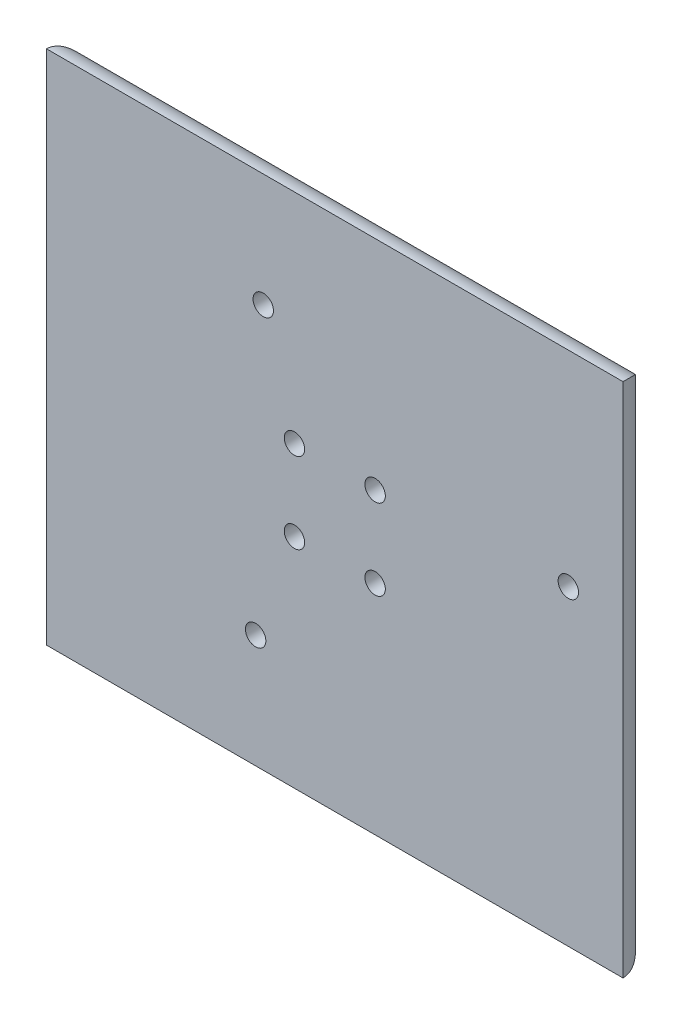
ISO-10303-21;
HEADER;
FILE_DESCRIPTION(('STEP AP214'),'2;1');
FILE_NAME('part.step','',(''),(''),'','','');
FILE_SCHEMA(('AUTOMOTIVE_DESIGN { 1 0 10303 214 1 1 1 1 }'));
ENDSEC;
DATA;
#1=APPLICATION_CONTEXT('core data for automotive mechanical design processes');
#2=APPLICATION_PROTOCOL_DEFINITION('international standard','automotive_design',2000,#1);
#3=PRODUCT_CONTEXT('',#1,'mechanical');
#4=PRODUCT('Part','Part','',(#3));
#5=PRODUCT_RELATED_PRODUCT_CATEGORY('part','',(#4));
#6=PRODUCT_DEFINITION_FORMATION('','',#4);
#7=PRODUCT_DEFINITION_CONTEXT('part definition',#1,'design');
#8=PRODUCT_DEFINITION('design','',#6,#7);
#9=PRODUCT_DEFINITION_SHAPE('','',#8);
#10=(LENGTH_UNIT() NAMED_UNIT(*) SI_UNIT(.MILLI.,.METRE.));
#11=(NAMED_UNIT(*) PLANE_ANGLE_UNIT() SI_UNIT($,.RADIAN.));
#12=(NAMED_UNIT(*) SI_UNIT($,.STERADIAN.) SOLID_ANGLE_UNIT());
#13=UNCERTAINTY_MEASURE_WITH_UNIT(LENGTH_MEASURE(1.E-05),#10,'distance_accuracy_value','');
#14=(GEOMETRIC_REPRESENTATION_CONTEXT(3) GLOBAL_UNCERTAINTY_ASSIGNED_CONTEXT((#13)) GLOBAL_UNIT_ASSIGNED_CONTEXT((#10,
#11,#12)) REPRESENTATION_CONTEXT('',''));
#15=CARTESIAN_POINT('',(0.,0.,0.));
#16=DIRECTION('',(0.,0.,1.));
#17=DIRECTION('',(1.,0.,0.));
#18=AXIS2_PLACEMENT_3D('',#15,#16,#17);
#19=CARTESIAN_POINT('',(0.,0.,5.));
#20=DIRECTION('',(0.,0.,1.));
#21=DIRECTION('',(1.,0.,0.));
#22=AXIS2_PLACEMENT_3D('',#19,#20,#21);
#23=PLANE('',#22);
#24=CARTESIAN_POINT('',(-9.71,10.9605362269612,5.));
#25=DIRECTION('',(0.,0.,1.));
#26=DIRECTION('',(1.,0.,0.));
#27=AXIS2_PLACEMENT_3D('',#24,#25,#26);
#28=CIRCLE('',#27,1.7);
#29=CARTESIAN_POINT('',(-8.01,10.9605362269612,5.));
#30=VERTEX_POINT('',#29);
#31=EDGE_CURVE('E164',#30,#30,#28,.T.);
#32=ORIENTED_EDGE('',*,*,#31,.F.);
#33=EDGE_LOOP('',(#32));
#34=FACE_BOUND('',#33,.T.);
#35=CARTESIAN_POINT('',(41.09,-4.27946377303883,5.));
#36=DIRECTION('',(0.,0.,1.));
#37=DIRECTION('',(1.,0.,0.));
#38=AXIS2_PLACEMENT_3D('',#35,#36,#37);
#39=CIRCLE('',#38,1.7);
#40=CARTESIAN_POINT('',(42.79,-4.27946377303883,5.));
#41=VERTEX_POINT('',#40);
#42=EDGE_CURVE('E166',#41,#41,#39,.T.);
#43=ORIENTED_EDGE('',*,*,#42,.F.);
#44=EDGE_LOOP('',(#43));
#45=FACE_BOUND('',#44,.T.);
#46=CARTESIAN_POINT('',(-10.98,-37.2994637730388,5.));
#47=DIRECTION('',(0.,0.,1.));
#48=DIRECTION('',(1.,0.,0.));
#49=AXIS2_PLACEMENT_3D('',#46,#47,#48);
#50=CIRCLE('',#49,1.7);
#51=CARTESIAN_POINT('',(-9.28,-37.2994637730388,5.));
#52=VERTEX_POINT('',#51);
#53=EDGE_CURVE('E174',#52,#52,#50,.T.);
#54=ORIENTED_EDGE('',*,*,#53,.F.);
#55=EDGE_LOOP('',(#54));
#56=FACE_BOUND('',#55,.T.);
#57=CARTESIAN_POINT('',(-4.5175144212722,-19.876978194311,5.));
#58=DIRECTION('',(0.,0.,1.));
#59=DIRECTION('',(1.,0.,0.));
#60=AXIS2_PLACEMENT_3D('',#57,#58,#59);
#61=CIRCLE('',#60,1.7);
#62=CARTESIAN_POINT('',(-2.8175144212722,-19.876978194311,5.));
#63=VERTEX_POINT('',#62);
#64=EDGE_CURVE('E180',#63,#63,#61,.T.);
#65=ORIENTED_EDGE('',*,*,#64,.F.);
#66=EDGE_LOOP('',(#65));
#67=FACE_BOUND('',#66,.T.);
#68=CARTESIAN_POINT('',(-4.5175144212722,-6.44194935176663,5.));
#69=DIRECTION('',(0.,0.,1.));
#70=DIRECTION('',(1.,0.,0.));
#71=AXIS2_PLACEMENT_3D('',#68,#69,#70);
#72=CIRCLE('',#71,1.7);
#73=CARTESIAN_POINT('',(-2.8175144212722,-6.44194935176663,5.));
#74=VERTEX_POINT('',#73);
#75=EDGE_CURVE('E186',#74,#74,#72,.T.);
#76=ORIENTED_EDGE('',*,*,#75,.F.);
#77=EDGE_LOOP('',(#76));
#78=FACE_BOUND('',#77,.T.);
#79=CARTESIAN_POINT('',(8.9175144212722,-6.44194935176663,5.));
#80=DIRECTION('',(0.,0.,1.));
#81=DIRECTION('',(1.,0.,0.));
#82=AXIS2_PLACEMENT_3D('',#79,#80,#81);
#83=CIRCLE('',#82,1.7);
#84=CARTESIAN_POINT('',(10.6175144212722,-6.44194935176663,5.));
#85=VERTEX_POINT('',#84);
#86=EDGE_CURVE('E192',#85,#85,#83,.T.);
#87=ORIENTED_EDGE('',*,*,#86,.F.);
#88=EDGE_LOOP('',(#87));
#89=FACE_BOUND('',#88,.T.);
#90=CARTESIAN_POINT('',(8.9175144212722,-19.876978194311,5.));
#91=DIRECTION('',(0.,0.,1.));
#92=DIRECTION('',(1.,0.,0.));
#93=AXIS2_PLACEMENT_3D('',#90,#91,#92);
#94=CIRCLE('',#93,1.7);
#95=CARTESIAN_POINT('',(10.6175144212722,-19.876978194311,5.));
#96=VERTEX_POINT('',#95);
#97=EDGE_CURVE('E198',#96,#96,#94,.T.);
#98=ORIENTED_EDGE('',*,*,#97,.F.);
#99=EDGE_LOOP('',(#98));
#100=FACE_BOUND('',#99,.T.);
#101=DIRECTION('',(0.,-1.,0.));
#102=VECTOR('',#101,1.);
#103=CARTESIAN_POINT('',(-45.8,-56.1594637730388,5.));
#104=LINE('',#103,#102);
#105=CARTESIAN_POINT('',(-45.8,29.8405362269612,5.));
#106=VERTEX_POINT('',#105);
#107=CARTESIAN_POINT('',(-45.8,-56.1594637730388,5.));
#108=VERTEX_POINT('',#107);
#109=EDGE_CURVE('E76',#106,#108,#104,.T.);
#110=ORIENTED_EDGE('',*,*,#109,.T.);
#111=DIRECTION('',(1.,0.,0.));
#112=VECTOR('',#111,1.);
#113=CARTESIAN_POINT('',(50.2,-56.1594637730388,5.));
#114=LINE('',#113,#112);
#115=CARTESIAN_POINT('',(50.2,-56.1594637730388,5.));
#116=VERTEX_POINT('',#115);
#117=EDGE_CURVE('E79',#108,#116,#114,.T.);
#118=ORIENTED_EDGE('',*,*,#117,.T.);
#119=DIRECTION('',(0.,1.,0.));
#120=VECTOR('',#119,1.);
#121=CARTESIAN_POINT('',(50.2,-56.1594637730388,5.));
#122=LINE('',#121,#120);
#123=CARTESIAN_POINT('',(50.2,29.8405362269612,5.));
#124=VERTEX_POINT('',#123);
#125=EDGE_CURVE('E97',#116,#124,#122,.T.);
#126=ORIENTED_EDGE('',*,*,#125,.T.);
#127=DIRECTION('',(-1.,0.,0.));
#128=VECTOR('',#127,1.);
#129=CARTESIAN_POINT('',(50.2,29.8405362269612,5.));
#130=LINE('',#129,#128);
#131=EDGE_CURVE('E81',#124,#106,#130,.T.);
#132=ORIENTED_EDGE('',*,*,#131,.T.);
#133=EDGE_LOOP('',(#110,#118,#126,#132));
#134=FACE_BOUND('',#133,.T.);
#135=ADVANCED_FACE('F35',(#34,#45,#56,#67,#78,#89,#100,#134),#23,.T.);
#136=CARTESIAN_POINT('',(0.,0.,0.));
#137=DIRECTION('',(0.,0.,1.));
#138=DIRECTION('',(1.,0.,0.));
#139=AXIS2_PLACEMENT_3D('',#136,#137,#138);
#140=PLANE('',#139);
#141=CARTESIAN_POINT('',(-9.71,10.9605362269612,0.));
#142=DIRECTION('',(0.,0.,1.));
#143=DIRECTION('',(1.,0.,0.));
#144=AXIS2_PLACEMENT_3D('',#141,#142,#143);
#145=CIRCLE('',#144,1.7);
#146=CARTESIAN_POINT('',(-8.01,10.9605362269612,0.));
#147=VERTEX_POINT('',#146);
#148=EDGE_CURVE('E162',#147,#147,#145,.T.);
#149=ORIENTED_EDGE('',*,*,#148,.T.);
#150=EDGE_LOOP('',(#149));
#151=FACE_BOUND('',#150,.T.);
#152=CARTESIAN_POINT('',(41.09,-4.27946377303883,0.));
#153=DIRECTION('',(0.,0.,1.));
#154=DIRECTION('',(1.,0.,0.));
#155=AXIS2_PLACEMENT_3D('',#152,#153,#154);
#156=CIRCLE('',#155,1.7);
#157=CARTESIAN_POINT('',(42.79,-4.27946377303883,0.));
#158=VERTEX_POINT('',#157);
#159=EDGE_CURVE('E171',#158,#158,#156,.T.);
#160=ORIENTED_EDGE('',*,*,#159,.T.);
#161=EDGE_LOOP('',(#160));
#162=FACE_BOUND('',#161,.T.);
#163=CARTESIAN_POINT('',(-10.98,-37.2994637730388,0.));
#164=DIRECTION('',(0.,0.,1.));
#165=DIRECTION('',(1.,0.,0.));
#166=AXIS2_PLACEMENT_3D('',#163,#164,#165);
#167=CIRCLE('',#166,1.7);
#168=CARTESIAN_POINT('',(-9.28,-37.2994637730388,0.));
#169=VERTEX_POINT('',#168);
#170=EDGE_CURVE('E177',#169,#169,#167,.T.);
#171=ORIENTED_EDGE('',*,*,#170,.T.);
#172=EDGE_LOOP('',(#171));
#173=FACE_BOUND('',#172,.T.);
#174=CARTESIAN_POINT('',(-4.5175144212722,-19.876978194311,0.));
#175=DIRECTION('',(0.,0.,1.));
#176=DIRECTION('',(1.,0.,0.));
#177=AXIS2_PLACEMENT_3D('',#174,#175,#176);
#178=CIRCLE('',#177,1.7);
#179=CARTESIAN_POINT('',(-2.8175144212722,-19.876978194311,0.));
#180=VERTEX_POINT('',#179);
#181=EDGE_CURVE('E183',#180,#180,#178,.T.);
#182=ORIENTED_EDGE('',*,*,#181,.T.);
#183=EDGE_LOOP('',(#182));
#184=FACE_BOUND('',#183,.T.);
#185=CARTESIAN_POINT('',(-4.5175144212722,-6.44194935176663,0.));
#186=DIRECTION('',(0.,0.,1.));
#187=DIRECTION('',(1.,0.,0.));
#188=AXIS2_PLACEMENT_3D('',#185,#186,#187);
#189=CIRCLE('',#188,1.7);
#190=CARTESIAN_POINT('',(-2.8175144212722,-6.44194935176663,0.));
#191=VERTEX_POINT('',#190);
#192=EDGE_CURVE('E189',#191,#191,#189,.T.);
#193=ORIENTED_EDGE('',*,*,#192,.T.);
#194=EDGE_LOOP('',(#193));
#195=FACE_BOUND('',#194,.T.);
#196=CARTESIAN_POINT('',(8.9175144212722,-6.44194935176663,0.));
#197=DIRECTION('',(0.,0.,1.));
#198=DIRECTION('',(1.,0.,0.));
#199=AXIS2_PLACEMENT_3D('',#196,#197,#198);
#200=CIRCLE('',#199,1.7);
#201=CARTESIAN_POINT('',(10.6175144212722,-6.44194935176663,0.));
#202=VERTEX_POINT('',#201);
#203=EDGE_CURVE('E195',#202,#202,#200,.T.);
#204=ORIENTED_EDGE('',*,*,#203,.T.);
#205=EDGE_LOOP('',(#204));
#206=FACE_BOUND('',#205,.T.);
#207=CARTESIAN_POINT('',(8.9175144212722,-19.876978194311,0.));
#208=DIRECTION('',(0.,0.,1.));
#209=DIRECTION('',(1.,0.,0.));
#210=AXIS2_PLACEMENT_3D('',#207,#208,#209);
#211=CIRCLE('',#210,1.7);
#212=CARTESIAN_POINT('',(10.6175144212722,-19.876978194311,0.));
#213=VERTEX_POINT('',#212);
#214=EDGE_CURVE('E106',#213,#213,#211,.T.);
#215=ORIENTED_EDGE('',*,*,#214,.T.);
#216=EDGE_LOOP('',(#215));
#217=FACE_BOUND('',#216,.T.);
#218=DIRECTION('',(0.,1.,0.));
#219=VECTOR('',#218,1.);
#220=CARTESIAN_POINT('',(45.2,0.,0.));
#221=LINE('',#220,#219);
#222=CARTESIAN_POINT('',(45.2,24.8405362269612,0.));
#223=VERTEX_POINT('',#222);
#224=CARTESIAN_POINT('',(45.2,-51.1594637730388,0.));
#225=VERTEX_POINT('',#224);
#226=EDGE_CURVE('E44',#223,#225,#221,.F.);
#227=ORIENTED_EDGE('',*,*,#226,.T.);
#228=DIRECTION('',(1.,0.,0.));
#229=VECTOR('',#228,1.);
#230=CARTESIAN_POINT('',(0.,-51.1594637730388,0.));
#231=LINE('',#230,#229);
#232=CARTESIAN_POINT('',(-40.8,-51.1594637730388,0.));
#233=VERTEX_POINT('',#232);
#234=EDGE_CURVE('E11',#225,#233,#231,.F.);
#235=ORIENTED_EDGE('',*,*,#234,.T.);
#236=DIRECTION('',(0.,-1.,0.));
#237=VECTOR('',#236,1.);
#238=CARTESIAN_POINT('',(-40.8,0.,0.));
#239=LINE('',#238,#237);
#240=CARTESIAN_POINT('',(-40.8,24.8405362269612,0.));
#241=VERTEX_POINT('',#240);
#242=EDGE_CURVE('E89',#233,#241,#239,.F.);
#243=ORIENTED_EDGE('',*,*,#242,.T.);
#244=DIRECTION('',(-1.,0.,0.));
#245=VECTOR('',#244,1.);
#246=CARTESIAN_POINT('',(0.,24.8405362269612,0.));
#247=LINE('',#246,#245);
#248=EDGE_CURVE('E55',#241,#223,#247,.F.);
#249=ORIENTED_EDGE('',*,*,#248,.T.);
#250=EDGE_LOOP('',(#227,#235,#243,#249));
#251=FACE_BOUND('',#250,.T.);
#252=ADVANCED_FACE('F120',(#151,#162,#173,#184,#195,#206,#217,#251),#140,.F.);
#253=CARTESIAN_POINT('',(50.2,24.8405362269612,5.));
#254=DIRECTION('',(-1.,0.,0.));
#255=DIRECTION('',(0.,-1.,0.));
#256=AXIS2_PLACEMENT_3D('',#253,#254,#255);
#257=CYLINDRICAL_SURFACE('',#256,5.);
#258=CARTESIAN_POINT('',(45.2,24.8405362269612,5.));
#259=DIRECTION('',(-0.707106781186548,0.707106781186547,0.));
#260=DIRECTION('',(-0.707106781186547,-0.707106781186548,0.));
#261=AXIS2_PLACEMENT_3D('',#258,#259,#260);
#262=ELLIPSE('',#261,7.07106781186548,5.);
#263=EDGE_CURVE('E91',#223,#124,#262,.F.);
#264=ORIENTED_EDGE('',*,*,#263,.F.);
#265=ORIENTED_EDGE('',*,*,#248,.F.);
#266=CARTESIAN_POINT('',(-40.8,24.8405362269611,5.));
#267=DIRECTION('',(-0.707106781186547,-0.707106781186548,0.));
#268=DIRECTION('',(0.707106781186548,-0.707106781186547,0.));
#269=AXIS2_PLACEMENT_3D('',#266,#267,#268);
#270=ELLIPSE('',#269,7.07106781186547,5.);
#271=EDGE_CURVE('E39',#106,#241,#270,.T.);
#272=ORIENTED_EDGE('',*,*,#271,.F.);
#273=ORIENTED_EDGE('',*,*,#131,.F.);
#274=EDGE_LOOP('',(#264,#265,#272,#273));
#275=FACE_BOUND('',#274,.T.);
#276=ADVANCED_FACE('F37',(#275),#257,.T.);
#277=CARTESIAN_POINT('',(-40.8,-56.1594637730388,5.));
#278=DIRECTION('',(0.,-1.,0.));
#279=DIRECTION('',(0.,0.,-1.));
#280=AXIS2_PLACEMENT_3D('',#277,#278,#279);
#281=CYLINDRICAL_SURFACE('',#280,5.);
#282=ORIENTED_EDGE('',*,*,#271,.T.);
#283=ORIENTED_EDGE('',*,*,#242,.F.);
#284=CARTESIAN_POINT('',(-40.8,-51.1594637730388,5.));
#285=DIRECTION('',(0.707106781186548,-0.707106781186547,0.));
#286=DIRECTION('',(-0.707106781186547,-0.707106781186548,0.));
#287=AXIS2_PLACEMENT_3D('',#284,#285,#286);
#288=ELLIPSE('',#287,7.07106781186548,5.);
#289=EDGE_CURVE('E87',#108,#233,#288,.T.);
#290=ORIENTED_EDGE('',*,*,#289,.F.);
#291=ORIENTED_EDGE('',*,*,#109,.F.);
#292=EDGE_LOOP('',(#282,#283,#290,#291));
#293=FACE_BOUND('',#292,.T.);
#294=ADVANCED_FACE('F88',(#293),#281,.T.);
#295=CARTESIAN_POINT('',(45.2,-56.1594637730388,5.));
#296=DIRECTION('',(0.,1.,0.));
#297=DIRECTION('',(0.,0.,1.));
#298=AXIS2_PLACEMENT_3D('',#295,#296,#297);
#299=CYLINDRICAL_SURFACE('',#298,5.);
#300=ORIENTED_EDGE('',*,*,#263,.T.);
#301=ORIENTED_EDGE('',*,*,#125,.F.);
#302=CARTESIAN_POINT('',(45.2,-51.1594637730388,5.));
#303=DIRECTION('',(0.707106781186547,0.707106781186548,0.));
#304=DIRECTION('',(-0.707106781186548,0.707106781186547,0.));
#305=AXIS2_PLACEMENT_3D('',#302,#303,#304);
#306=ELLIPSE('',#305,7.07106781186547,5.);
#307=EDGE_CURVE('E92',#225,#116,#306,.F.);
#308=ORIENTED_EDGE('',*,*,#307,.F.);
#309=ORIENTED_EDGE('',*,*,#226,.F.);
#310=EDGE_LOOP('',(#300,#301,#308,#309));
#311=FACE_BOUND('',#310,.T.);
#312=ADVANCED_FACE('F110',(#311),#299,.T.);
#313=CARTESIAN_POINT('',(50.2,-51.1594637730388,5.));
#314=DIRECTION('',(1.,0.,0.));
#315=DIRECTION('',(0.,1.,0.));
#316=AXIS2_PLACEMENT_3D('',#313,#314,#315);
#317=CYLINDRICAL_SURFACE('',#316,5.);
#318=ORIENTED_EDGE('',*,*,#289,.T.);
#319=ORIENTED_EDGE('',*,*,#234,.F.);
#320=ORIENTED_EDGE('',*,*,#307,.T.);
#321=ORIENTED_EDGE('',*,*,#117,.F.);
#322=EDGE_LOOP('',(#318,#319,#320,#321));
#323=FACE_BOUND('',#322,.T.);
#324=ADVANCED_FACE('F94',(#323),#317,.T.);
#325=CARTESIAN_POINT('',(8.9175144212722,-19.876978194311,5.));
#326=DIRECTION('',(0.,0.,1.));
#327=DIRECTION('',(1.,0.,0.));
#328=AXIS2_PLACEMENT_3D('',#325,#326,#327);
#329=CYLINDRICAL_SURFACE('',#328,1.7);
#330=ORIENTED_EDGE('',*,*,#214,.F.);
#331=EDGE_LOOP('',(#330));
#332=FACE_BOUND('',#331,.T.);
#333=ORIENTED_EDGE('',*,*,#97,.T.);
#334=EDGE_LOOP('',(#333));
#335=FACE_BOUND('',#334,.T.);
#336=ADVANCED_FACE('F117',(#332,#335),#329,.F.);
#337=CARTESIAN_POINT('',(8.9175144212722,-6.44194935176663,5.));
#338=DIRECTION('',(0.,0.,1.));
#339=DIRECTION('',(1.,0.,0.));
#340=AXIS2_PLACEMENT_3D('',#337,#338,#339);
#341=CYLINDRICAL_SURFACE('',#340,1.7);
#342=ORIENTED_EDGE('',*,*,#203,.F.);
#343=EDGE_LOOP('',(#342));
#344=FACE_BOUND('',#343,.T.);
#345=ORIENTED_EDGE('',*,*,#86,.T.);
#346=EDGE_LOOP('',(#345));
#347=FACE_BOUND('',#346,.T.);
#348=ADVANCED_FACE('F133',(#344,#347),#341,.F.);
#349=CARTESIAN_POINT('',(-4.5175144212722,-6.44194935176663,5.));
#350=DIRECTION('',(0.,0.,1.));
#351=DIRECTION('',(1.,0.,0.));
#352=AXIS2_PLACEMENT_3D('',#349,#350,#351);
#353=CYLINDRICAL_SURFACE('',#352,1.7);
#354=ORIENTED_EDGE('',*,*,#192,.F.);
#355=EDGE_LOOP('',(#354));
#356=FACE_BOUND('',#355,.T.);
#357=ORIENTED_EDGE('',*,*,#75,.T.);
#358=EDGE_LOOP('',(#357));
#359=FACE_BOUND('',#358,.T.);
#360=ADVANCED_FACE('F137',(#356,#359),#353,.F.);
#361=CARTESIAN_POINT('',(-4.5175144212722,-19.876978194311,5.));
#362=DIRECTION('',(0.,0.,1.));
#363=DIRECTION('',(1.,0.,0.));
#364=AXIS2_PLACEMENT_3D('',#361,#362,#363);
#365=CYLINDRICAL_SURFACE('',#364,1.7);
#366=ORIENTED_EDGE('',*,*,#181,.F.);
#367=EDGE_LOOP('',(#366));
#368=FACE_BOUND('',#367,.T.);
#369=ORIENTED_EDGE('',*,*,#64,.T.);
#370=EDGE_LOOP('',(#369));
#371=FACE_BOUND('',#370,.T.);
#372=ADVANCED_FACE('F141',(#368,#371),#365,.F.);
#373=CARTESIAN_POINT('',(-10.98,-37.2994637730388,5.));
#374=DIRECTION('',(0.,0.,1.));
#375=DIRECTION('',(1.,0.,0.));
#376=AXIS2_PLACEMENT_3D('',#373,#374,#375);
#377=CYLINDRICAL_SURFACE('',#376,1.7);
#378=ORIENTED_EDGE('',*,*,#170,.F.);
#379=EDGE_LOOP('',(#378));
#380=FACE_BOUND('',#379,.T.);
#381=ORIENTED_EDGE('',*,*,#53,.T.);
#382=EDGE_LOOP('',(#381));
#383=FACE_BOUND('',#382,.T.);
#384=ADVANCED_FACE('F145',(#380,#383),#377,.F.);
#385=CARTESIAN_POINT('',(41.09,-4.27946377303883,5.));
#386=DIRECTION('',(0.,0.,1.));
#387=DIRECTION('',(1.,0.,0.));
#388=AXIS2_PLACEMENT_3D('',#385,#386,#387);
#389=CYLINDRICAL_SURFACE('',#388,1.7);
#390=ORIENTED_EDGE('',*,*,#159,.F.);
#391=EDGE_LOOP('',(#390));
#392=FACE_BOUND('',#391,.T.);
#393=ORIENTED_EDGE('',*,*,#42,.T.);
#394=EDGE_LOOP('',(#393));
#395=FACE_BOUND('',#394,.T.);
#396=ADVANCED_FACE('F149',(#392,#395),#389,.F.);
#397=CARTESIAN_POINT('',(-9.71,10.9605362269612,5.));
#398=DIRECTION('',(0.,0.,1.));
#399=DIRECTION('',(1.,0.,0.));
#400=AXIS2_PLACEMENT_3D('',#397,#398,#399);
#401=CYLINDRICAL_SURFACE('',#400,1.7);
#402=ORIENTED_EDGE('',*,*,#148,.F.);
#403=EDGE_LOOP('',(#402));
#404=FACE_BOUND('',#403,.T.);
#405=ORIENTED_EDGE('',*,*,#31,.T.);
#406=EDGE_LOOP('',(#405));
#407=FACE_BOUND('',#406,.T.);
#408=ADVANCED_FACE('F153',(#404,#407),#401,.F.);
#409=CLOSED_SHELL('',(#135,#252,#276,#294,#312,#324,#336,#348,#360,#372,#384,#396,#408));
#410=MANIFOLD_SOLID_BREP('B2',#409);
#411=ADVANCED_BREP_SHAPE_REPRESENTATION('',(#18,#410),#14);
#412=SHAPE_DEFINITION_REPRESENTATION(#9,#411);
ENDSEC;
END-ISO-10303-21;
